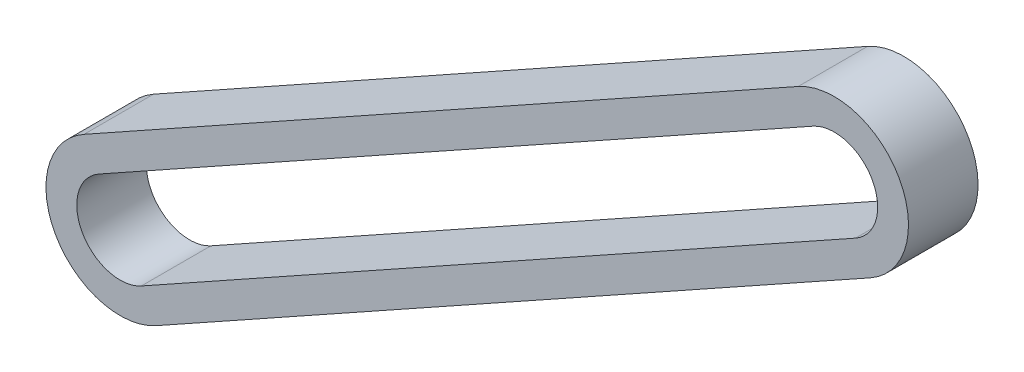
ISO-10303-21;
HEADER;
FILE_DESCRIPTION(('STEP AP214'),'2;1');
FILE_NAME('part.step','',(''),(''),'','','');
FILE_SCHEMA(('AUTOMOTIVE_DESIGN { 1 0 10303 214 1 1 1 1 }'));
ENDSEC;
DATA;
#1=APPLICATION_CONTEXT('core data for automotive mechanical design processes');
#2=APPLICATION_PROTOCOL_DEFINITION('international standard','automotive_design',2000,#1);
#3=PRODUCT_CONTEXT('',#1,'mechanical');
#4=PRODUCT('Part','Part','',(#3));
#5=PRODUCT_RELATED_PRODUCT_CATEGORY('part','',(#4));
#6=PRODUCT_DEFINITION_FORMATION('','',#4);
#7=PRODUCT_DEFINITION_CONTEXT('part definition',#1,'design');
#8=PRODUCT_DEFINITION('design','',#6,#7);
#9=PRODUCT_DEFINITION_SHAPE('','',#8);
#10=(LENGTH_UNIT() NAMED_UNIT(*) SI_UNIT(.MILLI.,.METRE.));
#11=(NAMED_UNIT(*) PLANE_ANGLE_UNIT() SI_UNIT($,.RADIAN.));
#12=(NAMED_UNIT(*) SI_UNIT($,.STERADIAN.) SOLID_ANGLE_UNIT());
#13=UNCERTAINTY_MEASURE_WITH_UNIT(LENGTH_MEASURE(1.E-05),#10,'distance_accuracy_value','');
#14=(GEOMETRIC_REPRESENTATION_CONTEXT(3) GLOBAL_UNCERTAINTY_ASSIGNED_CONTEXT((#13)) GLOBAL_UNIT_ASSIGNED_CONTEXT((#10,
#11,#12)) REPRESENTATION_CONTEXT('',''));
#15=CARTESIAN_POINT('',(0.,0.,0.));
#16=DIRECTION('',(0.,0.,1.));
#17=DIRECTION('',(1.,0.,0.));
#18=AXIS2_PLACEMENT_3D('',#15,#16,#17);
#19=CARTESIAN_POINT('',(0.,0.,-3.));
#20=DIRECTION('',(0.,0.,1.));
#21=DIRECTION('',(1.,0.,0.));
#22=AXIS2_PLACEMENT_3D('',#19,#20,#21);
#23=CYLINDRICAL_SURFACE('',#22,3.19999999999999);
#24=CARTESIAN_POINT('',(0.,0.,0.));
#25=DIRECTION('',(0.,0.,1.));
#26=DIRECTION('',(1.,0.,0.));
#27=AXIS2_PLACEMENT_3D('',#24,#25,#26);
#28=CIRCLE('',#27,3.19999999999999);
#29=CARTESIAN_POINT('',(-1.55929723436997,2.79438582427089,0.));
#30=VERTEX_POINT('',#29);
#31=CARTESIAN_POINT('',(1.55929723436999,-2.79438582427088,0.));
#32=VERTEX_POINT('',#31);
#33=EDGE_CURVE('E137',#30,#32,#28,.T.);
#34=ORIENTED_EDGE('',*,*,#33,.F.);
#35=DIRECTION('',(0.,0.,1.));
#36=VECTOR('',#35,1.);
#37=CARTESIAN_POINT('',(-1.55929723436997,2.79438582427089,-3.));
#38=LINE('',#37,#36);
#39=CARTESIAN_POINT('',(-1.55929723436997,2.79438582427089,-3.));
#40=VERTEX_POINT('',#39);
#41=EDGE_CURVE('E11',#40,#30,#38,.T.);
#42=ORIENTED_EDGE('',*,*,#41,.F.);
#43=CARTESIAN_POINT('',(0.,0.,-3.));
#44=DIRECTION('',(0.,0.,1.));
#45=DIRECTION('',(1.,0.,0.));
#46=AXIS2_PLACEMENT_3D('',#43,#44,#45);
#47=CIRCLE('',#46,3.19999999999999);
#48=CARTESIAN_POINT('',(1.55929723436999,-2.79438582427088,-3.));
#49=VERTEX_POINT('',#48);
#50=EDGE_CURVE('E141',#40,#49,#47,.T.);
#51=ORIENTED_EDGE('',*,*,#50,.T.);
#52=DIRECTION('',(0.,0.,1.));
#53=VECTOR('',#52,1.);
#54=CARTESIAN_POINT('',(1.55929723436999,-2.79438582427088,-3.));
#55=LINE('',#54,#53);
#56=EDGE_CURVE('E42',#49,#32,#55,.T.);
#57=ORIENTED_EDGE('',*,*,#56,.T.);
#58=EDGE_LOOP('',(#34,#42,#51,#57));
#59=FACE_BOUND('',#58,.T.);
#60=ADVANCED_FACE('F39',(#59),#23,.T.);
#61=CARTESIAN_POINT('',(-1.55929723436997,2.79438582427089,-3.));
#62=DIRECTION('',(-0.487280385740621,0.873245570084654,0.));
#63=DIRECTION('',(-0.873245570084654,-0.487280385740621,0.));
#64=AXIS2_PLACEMENT_3D('',#61,#62,#63);
#65=PLANE('',#64);
#66=DIRECTION('',(-0.873245570084654,-0.487280385740621,0.));
#67=VECTOR('',#66,1.);
#68=CARTESIAN_POINT('',(-1.55929723436997,2.79438582427089,0.));
#69=LINE('',#68,#67);
#70=CARTESIAN_POINT('',(29.24070276563,19.9811158747379,0.));
#71=VERTEX_POINT('',#70);
#72=EDGE_CURVE('E145',#71,#30,#69,.T.);
#73=ORIENTED_EDGE('',*,*,#72,.F.);
#74=DIRECTION('',(0.,0.,1.));
#75=VECTOR('',#74,1.);
#76=CARTESIAN_POINT('',(29.24070276563,19.9811158747379,-3.));
#77=LINE('',#76,#75);
#78=CARTESIAN_POINT('',(29.24070276563,19.9811158747379,-3.));
#79=VERTEX_POINT('',#78);
#80=EDGE_CURVE('E47',#79,#71,#77,.T.);
#81=ORIENTED_EDGE('',*,*,#80,.F.);
#82=DIRECTION('',(-0.873245570084654,-0.487280385740621,0.));
#83=VECTOR('',#82,1.);
#84=CARTESIAN_POINT('',(-1.55929723436997,2.79438582427089,-3.));
#85=LINE('',#84,#83);
#86=EDGE_CURVE('E151',#79,#40,#85,.T.);
#87=ORIENTED_EDGE('',*,*,#86,.T.);
#88=ORIENTED_EDGE('',*,*,#41,.T.);
#89=EDGE_LOOP('',(#73,#81,#87,#88));
#90=FACE_BOUND('',#89,.T.);
#91=ADVANCED_FACE('F177',(#90),#65,.T.);
#92=CARTESIAN_POINT('',(30.8,17.186730050467,-3.));
#93=DIRECTION('',(0.,0.,1.));
#94=DIRECTION('',(1.,0.,0.));
#95=AXIS2_PLACEMENT_3D('',#92,#93,#94);
#96=CYLINDRICAL_SURFACE('',#95,3.19999999999999);
#97=CARTESIAN_POINT('',(30.8,17.186730050467,0.));
#98=DIRECTION('',(0.,0.,1.));
#99=DIRECTION('',(1.,0.,0.));
#100=AXIS2_PLACEMENT_3D('',#97,#98,#99);
#101=CIRCLE('',#100,3.19999999999999);
#102=CARTESIAN_POINT('',(32.35929723437,14.3923442261961,0.));
#103=VERTEX_POINT('',#102);
#104=EDGE_CURVE('E159',#103,#71,#101,.T.);
#105=ORIENTED_EDGE('',*,*,#104,.F.);
#106=DIRECTION('',(0.,0.,1.));
#107=VECTOR('',#106,1.);
#108=CARTESIAN_POINT('',(32.35929723437,14.3923442261961,-3.));
#109=LINE('',#108,#107);
#110=CARTESIAN_POINT('',(32.35929723437,14.3923442261961,-3.));
#111=VERTEX_POINT('',#110);
#112=EDGE_CURVE('E164',#111,#103,#109,.T.);
#113=ORIENTED_EDGE('',*,*,#112,.F.);
#114=CARTESIAN_POINT('',(30.8,17.186730050467,-3.));
#115=DIRECTION('',(0.,0.,1.));
#116=DIRECTION('',(1.,0.,0.));
#117=AXIS2_PLACEMENT_3D('',#114,#115,#116);
#118=CIRCLE('',#117,3.19999999999999);
#119=EDGE_CURVE('E148',#111,#79,#118,.T.);
#120=ORIENTED_EDGE('',*,*,#119,.T.);
#121=ORIENTED_EDGE('',*,*,#80,.T.);
#122=EDGE_LOOP('',(#105,#113,#120,#121));
#123=FACE_BOUND('',#122,.T.);
#124=ADVANCED_FACE('F181',(#123),#96,.T.);
#125=CARTESIAN_POINT('',(1.55929723436999,-2.79438582427088,-3.));
#126=DIRECTION('',(0.487280385740621,-0.873245570084654,0.));
#127=DIRECTION('',(0.873245570084654,0.487280385740621,0.));
#128=AXIS2_PLACEMENT_3D('',#125,#126,#127);
#129=PLANE('',#128);
#130=DIRECTION('',(0.873245570084654,0.487280385740621,0.));
#131=VECTOR('',#130,1.);
#132=CARTESIAN_POINT('',(1.55929723436999,-2.79438582427088,0.));
#133=LINE('',#132,#131);
#134=EDGE_CURVE('E156',#32,#103,#133,.T.);
#135=ORIENTED_EDGE('',*,*,#134,.F.);
#136=ORIENTED_EDGE('',*,*,#56,.F.);
#137=DIRECTION('',(0.873245570084654,0.487280385740621,0.));
#138=VECTOR('',#137,1.);
#139=CARTESIAN_POINT('',(1.55929723436999,-2.79438582427088,-3.));
#140=LINE('',#139,#138);
#141=EDGE_CURVE('E144',#49,#111,#140,.T.);
#142=ORIENTED_EDGE('',*,*,#141,.T.);
#143=ORIENTED_EDGE('',*,*,#112,.T.);
#144=EDGE_LOOP('',(#135,#136,#142,#143));
#145=FACE_BOUND('',#144,.T.);
#146=ADVANCED_FACE('F172',(#145),#129,.T.);
#147=CARTESIAN_POINT('',(0.,0.,-3.));
#148=DIRECTION('',(0.,0.,1.));
#149=DIRECTION('',(1.,0.,0.));
#150=AXIS2_PLACEMENT_3D('',#147,#148,#149);
#151=PLANE('',#150);
#152=DIRECTION('',(-0.873245570084654,-0.487280385740621,0.));
#153=VECTOR('',#152,1.);
#154=CARTESIAN_POINT('',(-0.912188882106428,1.63471570719847,-3.));
#155=LINE('',#154,#153);
#156=CARTESIAN_POINT('',(29.8878111178936,18.8214457576655,-3.));
#157=VERTEX_POINT('',#156);
#158=CARTESIAN_POINT('',(-0.912188882106428,1.63471570719847,-3.));
#159=VERTEX_POINT('',#158);
#160=EDGE_CURVE('E112',#157,#159,#155,.T.);
#161=ORIENTED_EDGE('',*,*,#160,.T.);
#162=CARTESIAN_POINT('',(0.,0.,-3.));
#163=DIRECTION('',(0.,0.,1.));
#164=DIRECTION('',(1.,0.,0.));
#165=AXIS2_PLACEMENT_3D('',#162,#163,#164);
#166=CIRCLE('',#165,1.87199999999999);
#167=CARTESIAN_POINT('',(0.912188882106446,-1.63471570719846,-3.));
#168=VERTEX_POINT('',#167);
#169=EDGE_CURVE('E106',#159,#168,#166,.T.);
#170=ORIENTED_EDGE('',*,*,#169,.T.);
#171=DIRECTION('',(0.873245570084654,0.48728038574062,0.));
#172=VECTOR('',#171,1.);
#173=CARTESIAN_POINT('',(0.912188882106446,-1.63471570719846,-3.));
#174=LINE('',#173,#172);
#175=CARTESIAN_POINT('',(31.7121888821065,15.5520143432686,-3.));
#176=VERTEX_POINT('',#175);
#177=EDGE_CURVE('E115',#168,#176,#174,.T.);
#178=ORIENTED_EDGE('',*,*,#177,.T.);
#179=CARTESIAN_POINT('',(30.8,17.186730050467,-3.));
#180=DIRECTION('',(0.,0.,1.));
#181=DIRECTION('',(1.,0.,0.));
#182=AXIS2_PLACEMENT_3D('',#179,#180,#181);
#183=CIRCLE('',#182,1.87199999999999);
#184=EDGE_CURVE('E55',#176,#157,#183,.T.);
#185=ORIENTED_EDGE('',*,*,#184,.T.);
#186=EDGE_LOOP('',(#161,#170,#178,#185));
#187=FACE_BOUND('',#186,.T.);
#188=ORIENTED_EDGE('',*,*,#50,.F.);
#189=ORIENTED_EDGE('',*,*,#86,.F.);
#190=ORIENTED_EDGE('',*,*,#119,.F.);
#191=ORIENTED_EDGE('',*,*,#141,.F.);
#192=EDGE_LOOP('',(#188,#189,#190,#191));
#193=FACE_BOUND('',#192,.T.);
#194=ADVANCED_FACE('F119',(#187,#193),#151,.F.);
#195=CARTESIAN_POINT('',(0.,0.,0.));
#196=DIRECTION('',(0.,0.,1.));
#197=DIRECTION('',(1.,0.,0.));
#198=AXIS2_PLACEMENT_3D('',#195,#196,#197);
#199=PLANE('',#198);
#200=CARTESIAN_POINT('',(0.,0.,0.));
#201=DIRECTION('',(0.,0.,1.));
#202=DIRECTION('',(1.,0.,0.));
#203=AXIS2_PLACEMENT_3D('',#200,#201,#202);
#204=CIRCLE('',#203,1.87199999999999);
#205=CARTESIAN_POINT('',(-0.912188882106428,1.63471570719847,0.));
#206=VERTEX_POINT('',#205);
#207=CARTESIAN_POINT('',(0.912188882106446,-1.63471570719846,0.));
#208=VERTEX_POINT('',#207);
#209=EDGE_CURVE('E63',#206,#208,#204,.T.);
#210=ORIENTED_EDGE('',*,*,#209,.F.);
#211=DIRECTION('',(-0.873245570084654,-0.487280385740621,0.));
#212=VECTOR('',#211,1.);
#213=CARTESIAN_POINT('',(-0.912188882106428,1.63471570719847,0.));
#214=LINE('',#213,#212);
#215=CARTESIAN_POINT('',(29.8878111178936,18.8214457576655,0.));
#216=VERTEX_POINT('',#215);
#217=EDGE_CURVE('E122',#216,#206,#214,.T.);
#218=ORIENTED_EDGE('',*,*,#217,.F.);
#219=CARTESIAN_POINT('',(30.8,17.186730050467,0.));
#220=DIRECTION('',(0.,0.,1.));
#221=DIRECTION('',(1.,0.,0.));
#222=AXIS2_PLACEMENT_3D('',#219,#220,#221);
#223=CIRCLE('',#222,1.87199999999999);
#224=CARTESIAN_POINT('',(31.7121888821065,15.5520143432686,0.));
#225=VERTEX_POINT('',#224);
#226=EDGE_CURVE('E125',#225,#216,#223,.T.);
#227=ORIENTED_EDGE('',*,*,#226,.F.);
#228=DIRECTION('',(0.873245570084654,0.48728038574062,0.));
#229=VECTOR('',#228,1.);
#230=CARTESIAN_POINT('',(0.912188882106446,-1.63471570719846,0.));
#231=LINE('',#230,#229);
#232=EDGE_CURVE('E131',#208,#225,#231,.T.);
#233=ORIENTED_EDGE('',*,*,#232,.F.);
#234=EDGE_LOOP('',(#210,#218,#227,#233));
#235=FACE_BOUND('',#234,.T.);
#236=ORIENTED_EDGE('',*,*,#33,.T.);
#237=ORIENTED_EDGE('',*,*,#134,.T.);
#238=ORIENTED_EDGE('',*,*,#104,.T.);
#239=ORIENTED_EDGE('',*,*,#72,.T.);
#240=EDGE_LOOP('',(#236,#237,#238,#239));
#241=FACE_BOUND('',#240,.T.);
#242=ADVANCED_FACE('F174',(#235,#241),#199,.T.);
#243=CARTESIAN_POINT('',(0.,0.,-3.));
#244=DIRECTION('',(0.,0.,1.));
#245=DIRECTION('',(1.,0.,0.));
#246=AXIS2_PLACEMENT_3D('',#243,#244,#245);
#247=CYLINDRICAL_SURFACE('',#246,1.87199999999999);
#248=ORIENTED_EDGE('',*,*,#209,.T.);
#249=DIRECTION('',(0.,0.,1.));
#250=VECTOR('',#249,1.);
#251=CARTESIAN_POINT('',(0.912188882106446,-1.63471570719846,-3.));
#252=LINE('',#251,#250);
#253=EDGE_CURVE('E102',#168,#208,#252,.T.);
#254=ORIENTED_EDGE('',*,*,#253,.F.);
#255=ORIENTED_EDGE('',*,*,#169,.F.);
#256=DIRECTION('',(0.,0.,1.));
#257=VECTOR('',#256,1.);
#258=CARTESIAN_POINT('',(-0.912188882106428,1.63471570719847,-3.));
#259=LINE('',#258,#257);
#260=EDGE_CURVE('E135',#159,#206,#259,.T.);
#261=ORIENTED_EDGE('',*,*,#260,.T.);
#262=EDGE_LOOP('',(#248,#254,#255,#261));
#263=FACE_BOUND('',#262,.T.);
#264=ADVANCED_FACE('F104',(#263),#247,.F.);
#265=CARTESIAN_POINT('',(-0.912188882106428,1.63471570719847,-3.));
#266=DIRECTION('',(-0.487280385740621,0.873245570084654,0.));
#267=DIRECTION('',(-0.873245570084654,-0.487280385740621,0.));
#268=AXIS2_PLACEMENT_3D('',#265,#266,#267);
#269=PLANE('',#268);
#270=ORIENTED_EDGE('',*,*,#217,.T.);
#271=ORIENTED_EDGE('',*,*,#260,.F.);
#272=ORIENTED_EDGE('',*,*,#160,.F.);
#273=DIRECTION('',(0.,0.,1.));
#274=VECTOR('',#273,1.);
#275=CARTESIAN_POINT('',(29.8878111178936,18.8214457576655,-3.));
#276=LINE('',#275,#274);
#277=EDGE_CURVE('E138',#157,#216,#276,.T.);
#278=ORIENTED_EDGE('',*,*,#277,.T.);
#279=EDGE_LOOP('',(#270,#271,#272,#278));
#280=FACE_BOUND('',#279,.T.);
#281=ADVANCED_FACE('F234',(#280),#269,.F.);
#282=CARTESIAN_POINT('',(30.8,17.186730050467,-3.));
#283=DIRECTION('',(0.,0.,1.));
#284=DIRECTION('',(1.,0.,0.));
#285=AXIS2_PLACEMENT_3D('',#282,#283,#284);
#286=CYLINDRICAL_SURFACE('',#285,1.87199999999999);
#287=ORIENTED_EDGE('',*,*,#226,.T.);
#288=ORIENTED_EDGE('',*,*,#277,.F.);
#289=ORIENTED_EDGE('',*,*,#184,.F.);
#290=DIRECTION('',(0.,0.,1.));
#291=VECTOR('',#290,1.);
#292=CARTESIAN_POINT('',(31.7121888821065,15.5520143432686,-3.));
#293=LINE('',#292,#291);
#294=EDGE_CURVE('E111',#176,#225,#293,.T.);
#295=ORIENTED_EDGE('',*,*,#294,.T.);
#296=EDGE_LOOP('',(#287,#288,#289,#295));
#297=FACE_BOUND('',#296,.T.);
#298=ADVANCED_FACE('F243',(#297),#286,.F.);
#299=CARTESIAN_POINT('',(0.912188882106446,-1.63471570719846,-3.));
#300=DIRECTION('',(0.48728038574062,-0.873245570084654,0.));
#301=DIRECTION('',(0.873245570084654,0.48728038574062,0.));
#302=AXIS2_PLACEMENT_3D('',#299,#300,#301);
#303=PLANE('',#302);
#304=ORIENTED_EDGE('',*,*,#232,.T.);
#305=ORIENTED_EDGE('',*,*,#294,.F.);
#306=ORIENTED_EDGE('',*,*,#177,.F.);
#307=ORIENTED_EDGE('',*,*,#253,.T.);
#308=EDGE_LOOP('',(#304,#305,#306,#307));
#309=FACE_BOUND('',#308,.T.);
#310=ADVANCED_FACE('F116',(#309),#303,.F.);
#311=CLOSED_SHELL('',(#60,#91,#124,#146,#194,#242,#264,#281,#298,#310));
#312=MANIFOLD_SOLID_BREP('B2',#311);
#313=ADVANCED_BREP_SHAPE_REPRESENTATION('',(#18,#312),#14);
#314=SHAPE_DEFINITION_REPRESENTATION(#9,#313);
ENDSEC;
END-ISO-10303-21;
